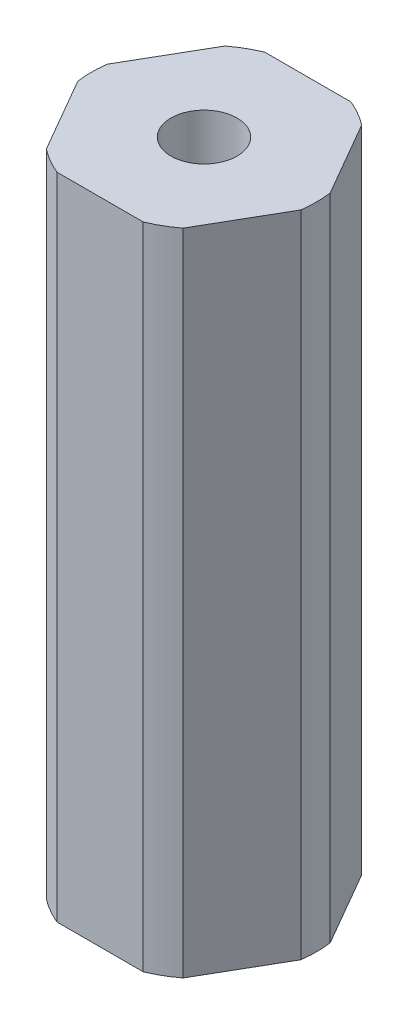
ISO-10303-21;
HEADER;
FILE_DESCRIPTION(('STEP AP214'),'2;1');
FILE_NAME('part.step','',(''),(''),'','','');
FILE_SCHEMA(('AUTOMOTIVE_DESIGN { 1 0 10303 214 1 1 1 1 }'));
ENDSEC;
DATA;
#1=APPLICATION_CONTEXT('core data for automotive mechanical design processes');
#2=APPLICATION_PROTOCOL_DEFINITION('international standard','automotive_design',2000,#1);
#3=PRODUCT_CONTEXT('',#1,'mechanical');
#4=PRODUCT('Part','Part','',(#3));
#5=PRODUCT_RELATED_PRODUCT_CATEGORY('part','',(#4));
#6=PRODUCT_DEFINITION_FORMATION('','',#4);
#7=PRODUCT_DEFINITION_CONTEXT('part definition',#1,'design');
#8=PRODUCT_DEFINITION('design','',#6,#7);
#9=PRODUCT_DEFINITION_SHAPE('','',#8);
#10=(LENGTH_UNIT() NAMED_UNIT(*) SI_UNIT(.MILLI.,.METRE.));
#11=(NAMED_UNIT(*) PLANE_ANGLE_UNIT() SI_UNIT($,.RADIAN.));
#12=(NAMED_UNIT(*) SI_UNIT($,.STERADIAN.) SOLID_ANGLE_UNIT());
#13=UNCERTAINTY_MEASURE_WITH_UNIT(LENGTH_MEASURE(1.E-05),#10,'distance_accuracy_value','');
#14=(GEOMETRIC_REPRESENTATION_CONTEXT(3) GLOBAL_UNCERTAINTY_ASSIGNED_CONTEXT((#13)) GLOBAL_UNIT_ASSIGNED_CONTEXT((#10,
#11,#12)) REPRESENTATION_CONTEXT('',''));
#15=CARTESIAN_POINT('',(0.,0.,0.));
#16=DIRECTION('',(0.,0.,1.));
#17=DIRECTION('',(1.,0.,0.));
#18=AXIS2_PLACEMENT_3D('',#15,#16,#17);
#19=CARTESIAN_POINT('',(5.49926131403119,39.6875,3.175));
#20=DIRECTION('',(0.866025403784439,0.,0.5));
#21=DIRECTION('',(0.5,0.,-0.866025403784439));
#22=AXIS2_PLACEMENT_3D('',#19,#20,#21);
#23=PLANE('',#22);
#24=DIRECTION('',(-0.5,0.,0.866025403784439));
#25=VECTOR('',#24,1.);
#26=CARTESIAN_POINT('',(5.49926131403119,39.6875,3.175));
#27=LINE('',#26,#25);
#28=CARTESIAN_POINT('',(6.81675182633099,39.6875,0.893039494206794));
#29=VERTEX_POINT('',#28);
#30=CARTESIAN_POINT('',(4.18177080173138,39.6875,5.45696050579321));
#31=VERTEX_POINT('',#30);
#32=EDGE_CURVE('E142',#29,#31,#27,.T.);
#33=ORIENTED_EDGE('',*,*,#32,.T.);
#34=DIRECTION('',(0.,-1.,0.));
#35=VECTOR('',#34,1.);
#36=CARTESIAN_POINT('',(4.18177080173138,44.7895078458514,5.45696050579321));
#37=LINE('',#36,#35);
#38=CARTESIAN_POINT('',(4.18177080173138,0.,5.45696050579321));
#39=VERTEX_POINT('',#38);
#40=EDGE_CURVE('E189',#31,#39,#37,.T.);
#41=ORIENTED_EDGE('',*,*,#40,.T.);
#42=DIRECTION('',(-0.5,0.,0.866025403784439));
#43=VECTOR('',#42,1.);
#44=CARTESIAN_POINT('',(5.49926131403119,0.,3.175));
#45=LINE('',#44,#43);
#46=CARTESIAN_POINT('',(6.81675182633099,0.,0.893039494206794));
#47=VERTEX_POINT('',#46);
#48=EDGE_CURVE('E131',#47,#39,#45,.T.);
#49=ORIENTED_EDGE('',*,*,#48,.F.);
#50=DIRECTION('',(0.,-1.,0.));
#51=VECTOR('',#50,1.);
#52=CARTESIAN_POINT('',(6.81675182633099,44.7895078458514,0.893039494206793));
#53=LINE('',#52,#51);
#54=EDGE_CURVE('E181',#47,#29,#53,.F.);
#55=ORIENTED_EDGE('',*,*,#54,.T.);
#56=EDGE_LOOP('',(#33,#41,#49,#55));
#57=FACE_BOUND('',#56,.T.);
#58=ADVANCED_FACE('F17',(#57),#23,.T.);
#59=CARTESIAN_POINT('',(0.,39.6875,6.35));
#60=DIRECTION('',(0.,0.,1.));
#61=DIRECTION('',(1.,0.,0.));
#62=AXIS2_PLACEMENT_3D('',#59,#60,#61);
#63=PLANE('',#62);
#64=DIRECTION('',(-1.,0.,0.));
#65=VECTOR('',#64,1.);
#66=CARTESIAN_POINT('',(0.,39.6875,6.35));
#67=LINE('',#66,#65);
#68=CARTESIAN_POINT('',(2.63498102459961,39.6875,6.35));
#69=VERTEX_POINT('',#68);
#70=CARTESIAN_POINT('',(-2.63498102459961,39.6875,6.35));
#71=VERTEX_POINT('',#70);
#72=EDGE_CURVE('E171',#69,#71,#67,.T.);
#73=ORIENTED_EDGE('',*,*,#72,.T.);
#74=DIRECTION('',(0.,-1.,0.));
#75=VECTOR('',#74,1.);
#76=CARTESIAN_POINT('',(-2.63498102459961,44.7895078458514,6.35));
#77=LINE('',#76,#75);
#78=CARTESIAN_POINT('',(-2.63498102459961,0.,6.35));
#79=VERTEX_POINT('',#78);
#80=EDGE_CURVE('E35',#71,#79,#77,.T.);
#81=ORIENTED_EDGE('',*,*,#80,.T.);
#82=DIRECTION('',(-1.,0.,0.));
#83=VECTOR('',#82,1.);
#84=CARTESIAN_POINT('',(0.,0.,6.35));
#85=LINE('',#84,#83);
#86=CARTESIAN_POINT('',(2.63498102459961,0.,6.35));
#87=VERTEX_POINT('',#86);
#88=EDGE_CURVE('E150',#87,#79,#85,.T.);
#89=ORIENTED_EDGE('',*,*,#88,.F.);
#90=DIRECTION('',(0.,-1.,0.));
#91=VECTOR('',#90,1.);
#92=CARTESIAN_POINT('',(2.63498102459961,44.7895078458514,6.35));
#93=LINE('',#92,#91);
#94=EDGE_CURVE('E193',#87,#69,#93,.F.);
#95=ORIENTED_EDGE('',*,*,#94,.T.);
#96=EDGE_LOOP('',(#73,#81,#89,#95));
#97=FACE_BOUND('',#96,.T.);
#98=ADVANCED_FACE('F249',(#97),#63,.T.);
#99=CARTESIAN_POINT('',(-5.49926131403119,39.6875,3.175));
#100=DIRECTION('',(-0.866025403784439,0.,0.5));
#101=DIRECTION('',(0.5,0.,0.866025403784439));
#102=AXIS2_PLACEMENT_3D('',#99,#100,#101);
#103=PLANE('',#102);
#104=DIRECTION('',(-0.5,0.,-0.866025403784439));
#105=VECTOR('',#104,1.);
#106=CARTESIAN_POINT('',(-5.49926131403119,39.6875,3.175));
#107=LINE('',#106,#105);
#108=CARTESIAN_POINT('',(-4.18177080173138,39.6875,5.45696050579321));
#109=VERTEX_POINT('',#108);
#110=CARTESIAN_POINT('',(-6.81675182633099,39.6875,0.893039494206794));
#111=VERTEX_POINT('',#110);
#112=EDGE_CURVE('E167',#109,#111,#107,.T.);
#113=ORIENTED_EDGE('',*,*,#112,.T.);
#114=DIRECTION('',(0.,-1.,0.));
#115=VECTOR('',#114,1.);
#116=CARTESIAN_POINT('',(-6.81675182633099,44.7895078458514,0.893039494206793));
#117=LINE('',#116,#115);
#118=CARTESIAN_POINT('',(-6.81675182633099,0.,0.893039494206794));
#119=VERTEX_POINT('',#118);
#120=EDGE_CURVE('E43',#111,#119,#117,.T.);
#121=ORIENTED_EDGE('',*,*,#120,.T.);
#122=DIRECTION('',(-0.5,0.,-0.866025403784439));
#123=VECTOR('',#122,1.);
#124=CARTESIAN_POINT('',(-5.49926131403119,0.,3.175));
#125=LINE('',#124,#123);
#126=CARTESIAN_POINT('',(-4.18177080173138,0.,5.45696050579321));
#127=VERTEX_POINT('',#126);
#128=EDGE_CURVE('E144',#127,#119,#125,.T.);
#129=ORIENTED_EDGE('',*,*,#128,.F.);
#130=DIRECTION('',(0.,-1.,0.));
#131=VECTOR('',#130,1.);
#132=CARTESIAN_POINT('',(-4.18177080173138,44.7895078458514,5.45696050579321));
#133=LINE('',#132,#131);
#134=EDGE_CURVE('E200',#127,#109,#133,.F.);
#135=ORIENTED_EDGE('',*,*,#134,.T.);
#136=EDGE_LOOP('',(#113,#121,#129,#135));
#137=FACE_BOUND('',#136,.T.);
#138=ADVANCED_FACE('F254',(#137),#103,.T.);
#139=CARTESIAN_POINT('',(-5.49926131403119,39.6875,-3.175));
#140=DIRECTION('',(-0.866025403784439,0.,-0.5));
#141=DIRECTION('',(-0.5,0.,0.866025403784439));
#142=AXIS2_PLACEMENT_3D('',#139,#140,#141);
#143=PLANE('',#142);
#144=DIRECTION('',(0.5,0.,-0.866025403784439));
#145=VECTOR('',#144,1.);
#146=CARTESIAN_POINT('',(-5.49926131403119,39.6875,-3.175));
#147=LINE('',#146,#145);
#148=CARTESIAN_POINT('',(-6.81675182633099,39.6875,-0.893039494206793));
#149=VERTEX_POINT('',#148);
#150=CARTESIAN_POINT('',(-4.18177080173138,39.6875,-5.45696050579321));
#151=VERTEX_POINT('',#150);
#152=EDGE_CURVE('E163',#149,#151,#147,.T.);
#153=ORIENTED_EDGE('',*,*,#152,.T.);
#154=DIRECTION('',(0.,-1.,0.));
#155=VECTOR('',#154,1.);
#156=CARTESIAN_POINT('',(-4.18177080173138,44.7895078458514,-5.45696050579321));
#157=LINE('',#156,#155);
#158=CARTESIAN_POINT('',(-4.18177080173138,0.,-5.45696050579321));
#159=VERTEX_POINT('',#158);
#160=EDGE_CURVE('E212',#151,#159,#157,.T.);
#161=ORIENTED_EDGE('',*,*,#160,.T.);
#162=DIRECTION('',(0.5,0.,-0.866025403784439));
#163=VECTOR('',#162,1.);
#164=CARTESIAN_POINT('',(-5.49926131403119,0.,-3.175));
#165=LINE('',#164,#163);
#166=CARTESIAN_POINT('',(-6.81675182633099,0.,-0.893039494206793));
#167=VERTEX_POINT('',#166);
#168=EDGE_CURVE('E137',#167,#159,#165,.T.);
#169=ORIENTED_EDGE('',*,*,#168,.F.);
#170=DIRECTION('',(0.,-1.,0.));
#171=VECTOR('',#170,1.);
#172=CARTESIAN_POINT('',(-6.81675182633099,44.7895078458514,-0.893039494206793));
#173=LINE('',#172,#171);
#174=EDGE_CURVE('E207',#167,#149,#173,.F.);
#175=ORIENTED_EDGE('',*,*,#174,.T.);
#176=EDGE_LOOP('',(#153,#161,#169,#175));
#177=FACE_BOUND('',#176,.T.);
#178=ADVANCED_FACE('F310',(#177),#143,.T.);
#179=CARTESIAN_POINT('',(0.,39.6875,-6.35));
#180=DIRECTION('',(0.,0.,-1.));
#181=DIRECTION('',(-1.,0.,0.));
#182=AXIS2_PLACEMENT_3D('',#179,#180,#181);
#183=PLANE('',#182);
#184=DIRECTION('',(1.,0.,0.));
#185=VECTOR('',#184,1.);
#186=CARTESIAN_POINT('',(0.,39.6875,-6.35));
#187=LINE('',#186,#185);
#188=CARTESIAN_POINT('',(-2.63498102459961,39.6875,-6.35));
#189=VERTEX_POINT('',#188);
#190=CARTESIAN_POINT('',(2.63498102459961,39.6875,-6.35));
#191=VERTEX_POINT('',#190);
#192=EDGE_CURVE('E129',#189,#191,#187,.T.);
#193=ORIENTED_EDGE('',*,*,#192,.T.);
#194=DIRECTION('',(0.,-1.,0.));
#195=VECTOR('',#194,1.);
#196=CARTESIAN_POINT('',(2.63498102459961,44.7895078458514,-6.35));
#197=LINE('',#196,#195);
#198=CARTESIAN_POINT('',(2.63498102459961,0.,-6.35));
#199=VERTEX_POINT('',#198);
#200=EDGE_CURVE('E110',#191,#199,#197,.T.);
#201=ORIENTED_EDGE('',*,*,#200,.T.);
#202=DIRECTION('',(1.,0.,0.));
#203=VECTOR('',#202,1.);
#204=CARTESIAN_POINT('',(0.,0.,-6.35));
#205=LINE('',#204,#203);
#206=CARTESIAN_POINT('',(-2.63498102459961,0.,-6.35));
#207=VERTEX_POINT('',#206);
#208=EDGE_CURVE('E127',#207,#199,#205,.T.);
#209=ORIENTED_EDGE('',*,*,#208,.F.);
#210=DIRECTION('',(0.,-1.,0.));
#211=VECTOR('',#210,1.);
#212=CARTESIAN_POINT('',(-2.63498102459961,44.7895078458514,-6.35));
#213=LINE('',#212,#211);
#214=EDGE_CURVE('E215',#207,#189,#213,.F.);
#215=ORIENTED_EDGE('',*,*,#214,.T.);
#216=EDGE_LOOP('',(#193,#201,#209,#215));
#217=FACE_BOUND('',#216,.T.);
#218=ADVANCED_FACE('F125',(#217),#183,.T.);
#219=CARTESIAN_POINT('',(5.49926131403119,39.6875,-3.175));
#220=DIRECTION('',(0.866025403784438,0.,-0.5));
#221=DIRECTION('',(-0.5,0.,-0.866025403784438));
#222=AXIS2_PLACEMENT_3D('',#219,#220,#221);
#223=PLANE('',#222);
#224=DIRECTION('',(0.5,0.,0.866025403784439));
#225=VECTOR('',#224,1.);
#226=CARTESIAN_POINT('',(5.49926131403119,39.6875,-3.175));
#227=LINE('',#226,#225);
#228=CARTESIAN_POINT('',(4.18177080173138,39.6875,-5.45696050579321));
#229=VERTEX_POINT('',#228);
#230=CARTESIAN_POINT('',(6.81675182633099,39.6875,-0.893039494206797));
#231=VERTEX_POINT('',#230);
#232=EDGE_CURVE('E157',#229,#231,#227,.T.);
#233=ORIENTED_EDGE('',*,*,#232,.T.);
#234=DIRECTION('',(0.,-1.,0.));
#235=VECTOR('',#234,1.);
#236=CARTESIAN_POINT('',(6.81675182633099,44.7895078458514,-0.893039494206798));
#237=LINE('',#236,#235);
#238=CARTESIAN_POINT('',(6.81675182633099,0.,-0.893039494206797));
#239=VERTEX_POINT('',#238);
#240=EDGE_CURVE('E185',#231,#239,#237,.T.);
#241=ORIENTED_EDGE('',*,*,#240,.T.);
#242=DIRECTION('',(0.5,0.,0.866025403784439));
#243=VECTOR('',#242,1.);
#244=CARTESIAN_POINT('',(5.49926131403119,0.,-3.175));
#245=LINE('',#244,#243);
#246=CARTESIAN_POINT('',(4.18177080173138,0.,-5.45696050579321));
#247=VERTEX_POINT('',#246);
#248=EDGE_CURVE('E20',#247,#239,#245,.T.);
#249=ORIENTED_EDGE('',*,*,#248,.F.);
#250=DIRECTION('',(0.,-1.,0.));
#251=VECTOR('',#250,1.);
#252=CARTESIAN_POINT('',(4.18177080173138,44.7895078458514,-5.45696050579321));
#253=LINE('',#252,#251);
#254=EDGE_CURVE('E113',#247,#229,#253,.F.);
#255=ORIENTED_EDGE('',*,*,#254,.T.);
#256=EDGE_LOOP('',(#233,#241,#249,#255));
#257=FACE_BOUND('',#256,.T.);
#258=ADVANCED_FACE('F244',(#257),#223,.T.);
#259=CARTESIAN_POINT('',(0.,39.6875,0.));
#260=DIRECTION('',(0.,-1.,0.));
#261=DIRECTION('',(1.,0.,0.));
#262=AXIS2_PLACEMENT_3D('',#259,#260,#261);
#263=PLANE('',#262);
#264=CARTESIAN_POINT('',(0.,39.6875,0.));
#265=DIRECTION('',(0.,-1.,0.));
#266=DIRECTION('',(0.,0.,-1.));
#267=AXIS2_PLACEMENT_3D('',#264,#265,#266);
#268=CIRCLE('',#267,2.0193);
#269=CARTESIAN_POINT('',(0.,39.6875,-2.0193));
#270=VERTEX_POINT('',#269);
#271=EDGE_CURVE('E120',#270,#270,#268,.T.);
#272=ORIENTED_EDGE('',*,*,#271,.T.);
#273=EDGE_LOOP('',(#272));
#274=FACE_BOUND('',#273,.T.);
#275=CARTESIAN_POINT('',(0.,39.6875,0.));
#276=DIRECTION('',(0.,-1.,0.));
#277=DIRECTION('',(0.,0.,-1.));
#278=AXIS2_PLACEMENT_3D('',#275,#276,#277);
#279=CIRCLE('',#278,6.875);
#280=EDGE_CURVE('E180',#191,#229,#279,.T.);
#281=ORIENTED_EDGE('',*,*,#280,.F.);
#282=ORIENTED_EDGE('',*,*,#192,.F.);
#283=EDGE_CURVE('E119',#151,#189,#279,.T.);
#284=ORIENTED_EDGE('',*,*,#283,.F.);
#285=ORIENTED_EDGE('',*,*,#152,.F.);
#286=EDGE_CURVE('E211',#111,#149,#279,.T.);
#287=ORIENTED_EDGE('',*,*,#286,.F.);
#288=ORIENTED_EDGE('',*,*,#112,.F.);
#289=EDGE_CURVE('E204',#71,#109,#279,.T.);
#290=ORIENTED_EDGE('',*,*,#289,.F.);
#291=ORIENTED_EDGE('',*,*,#72,.F.);
#292=EDGE_CURVE('E197',#31,#69,#279,.T.);
#293=ORIENTED_EDGE('',*,*,#292,.F.);
#294=ORIENTED_EDGE('',*,*,#32,.F.);
#295=EDGE_CURVE('E188',#231,#29,#279,.T.);
#296=ORIENTED_EDGE('',*,*,#295,.F.);
#297=ORIENTED_EDGE('',*,*,#232,.F.);
#298=EDGE_LOOP('',(#281,#282,#284,#285,#287,#288,#290,#291,#293,#294,#296,#297));
#299=FACE_BOUND('',#298,.T.);
#300=ADVANCED_FACE('F233',(#274,#299),#263,.F.);
#301=CARTESIAN_POINT('',(0.,0.,0.));
#302=DIRECTION('',(0.,-1.,0.));
#303=DIRECTION('',(1.,0.,0.));
#304=AXIS2_PLACEMENT_3D('',#301,#302,#303);
#305=PLANE('',#304);
#306=CARTESIAN_POINT('',(0.,0.,0.));
#307=DIRECTION('',(0.,-1.,0.));
#308=DIRECTION('',(0.,0.,-1.));
#309=AXIS2_PLACEMENT_3D('',#306,#307,#308);
#310=CIRCLE('',#309,2.0193);
#311=CARTESIAN_POINT('',(0.,0.,-2.0193));
#312=VERTEX_POINT('',#311);
#313=EDGE_CURVE('E223',#312,#312,#310,.T.);
#314=ORIENTED_EDGE('',*,*,#313,.F.);
#315=EDGE_LOOP('',(#314));
#316=FACE_BOUND('',#315,.T.);
#317=ORIENTED_EDGE('',*,*,#208,.T.);
#318=CARTESIAN_POINT('',(0.,0.,0.));
#319=DIRECTION('',(0.,-1.,0.));
#320=DIRECTION('',(0.,0.,-1.));
#321=AXIS2_PLACEMENT_3D('',#318,#319,#320);
#322=CIRCLE('',#321,6.875);
#323=EDGE_CURVE('E28',#199,#247,#322,.T.);
#324=ORIENTED_EDGE('',*,*,#323,.T.);
#325=ORIENTED_EDGE('',*,*,#248,.T.);
#326=EDGE_CURVE('E11',#239,#47,#322,.T.);
#327=ORIENTED_EDGE('',*,*,#326,.T.);
#328=ORIENTED_EDGE('',*,*,#48,.T.);
#329=EDGE_CURVE('E26',#39,#87,#322,.T.);
#330=ORIENTED_EDGE('',*,*,#329,.T.);
#331=ORIENTED_EDGE('',*,*,#88,.T.);
#332=EDGE_CURVE('E408',#79,#127,#322,.T.);
#333=ORIENTED_EDGE('',*,*,#332,.T.);
#334=ORIENTED_EDGE('',*,*,#128,.T.);
#335=EDGE_CURVE('E405',#119,#167,#322,.T.);
#336=ORIENTED_EDGE('',*,*,#335,.T.);
#337=ORIENTED_EDGE('',*,*,#168,.T.);
#338=EDGE_CURVE('E121',#159,#207,#322,.T.);
#339=ORIENTED_EDGE('',*,*,#338,.T.);
#340=EDGE_LOOP('',(#317,#324,#325,#327,#328,#330,#331,#333,#334,#336,#337,#339));
#341=FACE_BOUND('',#340,.T.);
#342=ADVANCED_FACE('F134',(#316,#341),#305,.T.);
#343=CARTESIAN_POINT('',(0.,44.7895078458514,0.));
#344=DIRECTION('',(0.,-1.,0.));
#345=DIRECTION('',(0.,0.,-1.));
#346=AXIS2_PLACEMENT_3D('',#343,#344,#345);
#347=CYLINDRICAL_SURFACE('',#346,6.875);
#348=ORIENTED_EDGE('',*,*,#283,.T.);
#349=ORIENTED_EDGE('',*,*,#214,.F.);
#350=ORIENTED_EDGE('',*,*,#338,.F.);
#351=ORIENTED_EDGE('',*,*,#160,.F.);
#352=EDGE_LOOP('',(#348,#349,#350,#351));
#353=FACE_BOUND('',#352,.T.);
#354=ADVANCED_FACE('F232',(#353),#347,.T.);
#355=ORIENTED_EDGE('',*,*,#286,.T.);
#356=ORIENTED_EDGE('',*,*,#174,.F.);
#357=ORIENTED_EDGE('',*,*,#335,.F.);
#358=ORIENTED_EDGE('',*,*,#120,.F.);
#359=EDGE_LOOP('',(#355,#356,#357,#358));
#360=FACE_BOUND('',#359,.T.);
#361=ADVANCED_FACE('F241',(#360),#347,.T.);
#362=ORIENTED_EDGE('',*,*,#289,.T.);
#363=ORIENTED_EDGE('',*,*,#134,.F.);
#364=ORIENTED_EDGE('',*,*,#332,.F.);
#365=ORIENTED_EDGE('',*,*,#80,.F.);
#366=EDGE_LOOP('',(#362,#363,#364,#365));
#367=FACE_BOUND('',#366,.T.);
#368=ADVANCED_FACE('F279',(#367),#347,.T.);
#369=ORIENTED_EDGE('',*,*,#292,.T.);
#370=ORIENTED_EDGE('',*,*,#94,.F.);
#371=ORIENTED_EDGE('',*,*,#329,.F.);
#372=ORIENTED_EDGE('',*,*,#40,.F.);
#373=EDGE_LOOP('',(#369,#370,#371,#372));
#374=FACE_BOUND('',#373,.T.);
#375=ADVANCED_FACE('F275',(#374),#347,.T.);
#376=ORIENTED_EDGE('',*,*,#326,.F.);
#377=ORIENTED_EDGE('',*,*,#240,.F.);
#378=ORIENTED_EDGE('',*,*,#295,.T.);
#379=ORIENTED_EDGE('',*,*,#54,.F.);
#380=EDGE_LOOP('',(#376,#377,#378,#379));
#381=FACE_BOUND('',#380,.T.);
#382=ADVANCED_FACE('F273',(#381),#347,.T.);
#383=ORIENTED_EDGE('',*,*,#280,.T.);
#384=ORIENTED_EDGE('',*,*,#254,.F.);
#385=ORIENTED_EDGE('',*,*,#323,.F.);
#386=ORIENTED_EDGE('',*,*,#200,.F.);
#387=EDGE_LOOP('',(#383,#384,#385,#386));
#388=FACE_BOUND('',#387,.T.);
#389=ADVANCED_FACE('F109',(#388),#347,.T.);
#390=CARTESIAN_POINT('',(0.,43.8899516436607,0.));
#391=DIRECTION('',(0.,-1.,0.));
#392=DIRECTION('',(0.,0.,-1.));
#393=AXIS2_PLACEMENT_3D('',#390,#391,#392);
#394=CYLINDRICAL_SURFACE('',#393,2.0193);
#395=ORIENTED_EDGE('',*,*,#313,.T.);
#396=EDGE_LOOP('',(#395));
#397=FACE_BOUND('',#396,.T.);
#398=ORIENTED_EDGE('',*,*,#271,.F.);
#399=EDGE_LOOP('',(#398));
#400=FACE_BOUND('',#399,.T.);
#401=ADVANCED_FACE('F228',(#397,#400),#394,.F.);
#402=CLOSED_SHELL('',(#58,#98,#138,#178,#218,#258,#300,#342,#354,#361,#368,#375,#382,#389,#401));
#403=MANIFOLD_SOLID_BREP('B1',#402);
#404=ADVANCED_BREP_SHAPE_REPRESENTATION('',(#18,#403),#14);
#405=SHAPE_DEFINITION_REPRESENTATION(#9,#404);
ENDSEC;
END-ISO-10303-21;
